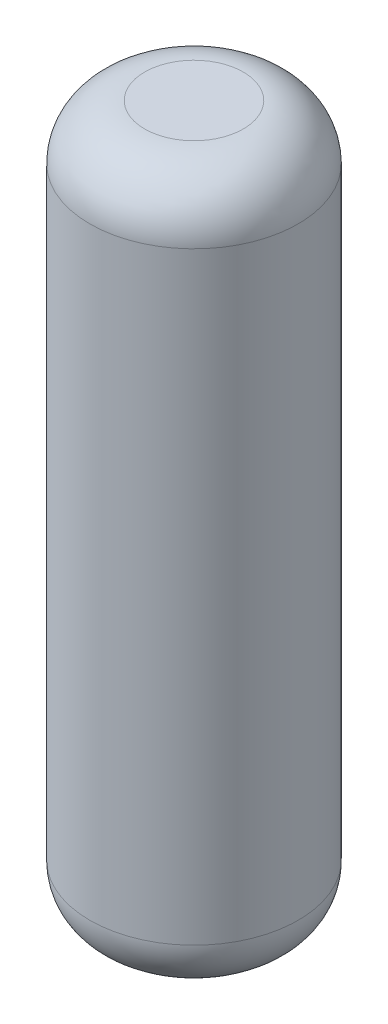
ISO-10303-21;
HEADER;
FILE_DESCRIPTION(('STEP AP214'),'2;1');
FILE_NAME('part.step','',(''),(''),'','','');
FILE_SCHEMA(('AUTOMOTIVE_DESIGN { 1 0 10303 214 1 1 1 1 }'));
ENDSEC;
DATA;
#1=APPLICATION_CONTEXT('core data for automotive mechanical design processes');
#2=APPLICATION_PROTOCOL_DEFINITION('international standard','automotive_design',2000,#1);
#3=PRODUCT_CONTEXT('',#1,'mechanical');
#4=PRODUCT('Part','Part','',(#3));
#5=PRODUCT_RELATED_PRODUCT_CATEGORY('part','',(#4));
#6=PRODUCT_DEFINITION_FORMATION('','',#4);
#7=PRODUCT_DEFINITION_CONTEXT('part definition',#1,'design');
#8=PRODUCT_DEFINITION('design','',#6,#7);
#9=PRODUCT_DEFINITION_SHAPE('','',#8);
#10=(LENGTH_UNIT() NAMED_UNIT(*) SI_UNIT(.MILLI.,.METRE.));
#11=(NAMED_UNIT(*) PLANE_ANGLE_UNIT() SI_UNIT($,.RADIAN.));
#12=(NAMED_UNIT(*) SI_UNIT($,.STERADIAN.) SOLID_ANGLE_UNIT());
#13=UNCERTAINTY_MEASURE_WITH_UNIT(LENGTH_MEASURE(1.E-05),#10,'distance_accuracy_value','');
#14=(GEOMETRIC_REPRESENTATION_CONTEXT(3) GLOBAL_UNCERTAINTY_ASSIGNED_CONTEXT((#13)) GLOBAL_UNIT_ASSIGNED_CONTEXT((#10,
#11,#12)) REPRESENTATION_CONTEXT('',''));
#15=CARTESIAN_POINT('',(0.,0.,0.));
#16=DIRECTION('',(0.,0.,1.));
#17=DIRECTION('',(1.,0.,0.));
#18=AXIS2_PLACEMENT_3D('',#15,#16,#17);
#19=CARTESIAN_POINT('',(0.,330.2,0.));
#20=DIRECTION('',(0.,-1.,0.));
#21=DIRECTION('',(0.,0.,-1.));
#22=AXIS2_PLACEMENT_3D('',#19,#20,#21);
#23=CYLINDRICAL_SURFACE('',#22,48.26);
#24=CARTESIAN_POINT('',(0.,25.4,0.));
#25=DIRECTION('',(0.,1.,0.));
#26=DIRECTION('',(0.,0.,1.));
#27=AXIS2_PLACEMENT_3D('',#24,#25,#26);
#28=CIRCLE('',#27,48.26);
#29=CARTESIAN_POINT('',(0.,25.4,48.26));
#30=VERTEX_POINT('',#29);
#31=EDGE_CURVE('E50',#30,#30,#28,.T.);
#32=ORIENTED_EDGE('',*,*,#31,.T.);
#33=EDGE_LOOP('',(#32));
#34=FACE_BOUND('',#33,.T.);
#35=CARTESIAN_POINT('',(0.,304.8,0.));
#36=DIRECTION('',(0.,1.,0.));
#37=DIRECTION('',(0.,0.,1.));
#38=AXIS2_PLACEMENT_3D('',#35,#36,#37);
#39=CIRCLE('',#38,48.26);
#40=CARTESIAN_POINT('',(0.,304.8,48.26));
#41=VERTEX_POINT('',#40);
#42=EDGE_CURVE('E55',#41,#41,#39,.F.);
#43=ORIENTED_EDGE('',*,*,#42,.T.);
#44=EDGE_LOOP('',(#43));
#45=FACE_BOUND('',#44,.T.);
#46=ADVANCED_FACE('F37',(#34,#45),#23,.T.);
#47=CARTESIAN_POINT('',(0.,330.2,0.));
#48=DIRECTION('',(0.,1.,0.));
#49=DIRECTION('',(0.,0.,1.));
#50=AXIS2_PLACEMENT_3D('',#47,#48,#49);
#51=PLANE('',#50);
#52=CARTESIAN_POINT('',(0.,330.2,0.));
#53=DIRECTION('',(0.,1.,0.));
#54=DIRECTION('',(0.,0.,1.));
#55=AXIS2_PLACEMENT_3D('',#52,#53,#54);
#56=CIRCLE('',#55,22.86);
#57=CARTESIAN_POINT('',(0.,330.2,22.86));
#58=VERTEX_POINT('',#57);
#59=EDGE_CURVE('E10',#58,#58,#56,.T.);
#60=ORIENTED_EDGE('',*,*,#59,.T.);
#61=EDGE_LOOP('',(#60));
#62=FACE_BOUND('',#61,.T.);
#63=ADVANCED_FACE('F72',(#62),#51,.T.);
#64=CARTESIAN_POINT('',(0.,0.,0.));
#65=DIRECTION('',(0.,1.,0.));
#66=DIRECTION('',(0.,0.,1.));
#67=AXIS2_PLACEMENT_3D('',#64,#65,#66);
#68=PLANE('',#67);
#69=CARTESIAN_POINT('',(0.,0.,0.));
#70=DIRECTION('',(0.,1.,0.));
#71=DIRECTION('',(0.,0.,1.));
#72=AXIS2_PLACEMENT_3D('',#69,#70,#71);
#73=CIRCLE('',#72,22.86);
#74=CARTESIAN_POINT('',(0.,0.,22.86));
#75=VERTEX_POINT('',#74);
#76=EDGE_CURVE('E45',#75,#75,#73,.F.);
#77=ORIENTED_EDGE('',*,*,#76,.T.);
#78=EDGE_LOOP('',(#77));
#79=FACE_BOUND('',#78,.T.);
#80=ADVANCED_FACE('F69',(#79),#68,.F.);
#81=CARTESIAN_POINT('',(0.,25.4,0.));
#82=DIRECTION('',(0.,1.,0.));
#83=DIRECTION('',(0.,0.,1.));
#84=AXIS2_PLACEMENT_3D('',#81,#82,#83);
#85=DEGENERATE_TOROIDAL_SURFACE('',#84,22.86,25.4,.T.);
#86=ORIENTED_EDGE('',*,*,#76,.F.);
#87=EDGE_LOOP('',(#86));
#88=FACE_BOUND('',#87,.T.);
#89=ORIENTED_EDGE('',*,*,#31,.F.);
#90=EDGE_LOOP('',(#89));
#91=FACE_BOUND('',#90,.T.);
#92=ADVANCED_FACE('F65',(#88,#91),#85,.T.);
#93=CARTESIAN_POINT('',(0.,304.8,0.));
#94=DIRECTION('',(0.,1.,0.));
#95=DIRECTION('',(0.,0.,1.));
#96=AXIS2_PLACEMENT_3D('',#93,#94,#95);
#97=DEGENERATE_TOROIDAL_SURFACE('',#96,22.86,25.4,.T.);
#98=ORIENTED_EDGE('',*,*,#42,.F.);
#99=EDGE_LOOP('',(#98));
#100=FACE_BOUND('',#99,.T.);
#101=ORIENTED_EDGE('',*,*,#59,.F.);
#102=EDGE_LOOP('',(#101));
#103=FACE_BOUND('',#102,.T.);
#104=ADVANCED_FACE('F39',(#100,#103),#97,.T.);
#105=CLOSED_SHELL('',(#46,#63,#80,#92,#104));
#106=MANIFOLD_SOLID_BREP('B2',#105);
#107=ADVANCED_BREP_SHAPE_REPRESENTATION('',(#18,#106),#14);
#108=SHAPE_DEFINITION_REPRESENTATION(#9,#107);
ENDSEC;
END-ISO-10303-21;
